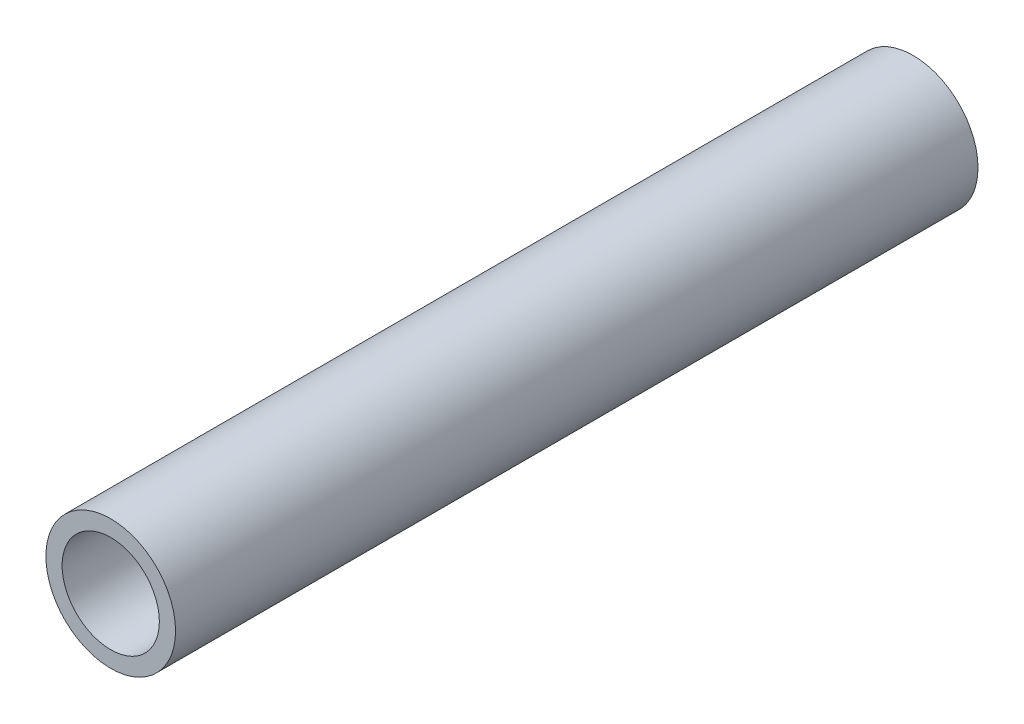
ISO-10303-21;
HEADER;
FILE_DESCRIPTION(('STEP AP214'),'2;1');
FILE_NAME('part.step','',(''),(''),'','','');
FILE_SCHEMA(('AUTOMOTIVE_DESIGN { 1 0 10303 214 1 1 1 1 }'));
ENDSEC;
DATA;
#1=APPLICATION_CONTEXT('core data for automotive mechanical design processes');
#2=APPLICATION_PROTOCOL_DEFINITION('international standard','automotive_design',2000,#1);
#3=PRODUCT_CONTEXT('',#1,'mechanical');
#4=PRODUCT('Part','Part','',(#3));
#5=PRODUCT_RELATED_PRODUCT_CATEGORY('part','',(#4));
#6=PRODUCT_DEFINITION_FORMATION('','',#4);
#7=PRODUCT_DEFINITION_CONTEXT('part definition',#1,'design');
#8=PRODUCT_DEFINITION('design','',#6,#7);
#9=PRODUCT_DEFINITION_SHAPE('','',#8);
#10=(LENGTH_UNIT() NAMED_UNIT(*) SI_UNIT(.MILLI.,.METRE.));
#11=(NAMED_UNIT(*) PLANE_ANGLE_UNIT() SI_UNIT($,.RADIAN.));
#12=(NAMED_UNIT(*) SI_UNIT($,.STERADIAN.) SOLID_ANGLE_UNIT());
#13=UNCERTAINTY_MEASURE_WITH_UNIT(LENGTH_MEASURE(1.E-05),#10,'distance_accuracy_value','');
#14=(GEOMETRIC_REPRESENTATION_CONTEXT(3) GLOBAL_UNCERTAINTY_ASSIGNED_CONTEXT((#13)) GLOBAL_UNIT_ASSIGNED_CONTEXT((#10,
#11,#12)) REPRESENTATION_CONTEXT('',''));
#15=CARTESIAN_POINT('',(0.,0.,0.));
#16=DIRECTION('',(0.,0.,1.));
#17=DIRECTION('',(1.,0.,0.));
#18=AXIS2_PLACEMENT_3D('',#15,#16,#17);
#19=CARTESIAN_POINT('',(0.,0.,49.5));
#20=DIRECTION('',(0.,0.,1.));
#21=DIRECTION('',(1.,0.,0.));
#22=AXIS2_PLACEMENT_3D('',#19,#20,#21);
#23=PLANE('',#22);
#24=CARTESIAN_POINT('',(0.,0.,49.5));
#25=DIRECTION('',(0.,0.,1.));
#26=DIRECTION('',(1.,0.,0.));
#27=AXIS2_PLACEMENT_3D('',#24,#25,#26);
#28=CIRCLE('',#27,4.);
#29=CARTESIAN_POINT('',(4.,0.,49.5));
#30=VERTEX_POINT('',#29);
#31=EDGE_CURVE('E11',#30,#30,#28,.T.);
#32=ORIENTED_EDGE('',*,*,#31,.T.);
#33=EDGE_LOOP('',(#32));
#34=FACE_BOUND('',#33,.T.);
#35=CARTESIAN_POINT('',(0.,0.,49.5));
#36=DIRECTION('',(0.,0.,1.));
#37=DIRECTION('',(1.,0.,0.));
#38=AXIS2_PLACEMENT_3D('',#35,#36,#37);
#39=CIRCLE('',#38,3.);
#40=CARTESIAN_POINT('',(3.,0.,49.5));
#41=VERTEX_POINT('',#40);
#42=EDGE_CURVE('E62',#41,#41,#39,.T.);
#43=ORIENTED_EDGE('',*,*,#42,.F.);
#44=EDGE_LOOP('',(#43));
#45=FACE_BOUND('',#44,.T.);
#46=ADVANCED_FACE('F48',(#34,#45),#23,.T.);
#47=CARTESIAN_POINT('',(0.,0.,0.));
#48=DIRECTION('',(0.,0.,1.));
#49=DIRECTION('',(1.,0.,0.));
#50=AXIS2_PLACEMENT_3D('',#47,#48,#49);
#51=PLANE('',#50);
#52=CARTESIAN_POINT('',(0.,0.,0.));
#53=DIRECTION('',(0.,0.,1.));
#54=DIRECTION('',(1.,0.,0.));
#55=AXIS2_PLACEMENT_3D('',#52,#53,#54);
#56=CIRCLE('',#55,4.);
#57=CARTESIAN_POINT('',(4.,0.,0.));
#58=VERTEX_POINT('',#57);
#59=EDGE_CURVE('E55',#58,#58,#56,.T.);
#60=ORIENTED_EDGE('',*,*,#59,.F.);
#61=EDGE_LOOP('',(#60));
#62=FACE_BOUND('',#61,.T.);
#63=CARTESIAN_POINT('',(0.,0.,0.));
#64=DIRECTION('',(0.,0.,1.));
#65=DIRECTION('',(1.,0.,0.));
#66=AXIS2_PLACEMENT_3D('',#63,#64,#65);
#67=CIRCLE('',#66,3.);
#68=CARTESIAN_POINT('',(3.,0.,0.));
#69=VERTEX_POINT('',#68);
#70=EDGE_CURVE('E63',#69,#69,#67,.T.);
#71=ORIENTED_EDGE('',*,*,#70,.T.);
#72=EDGE_LOOP('',(#71));
#73=FACE_BOUND('',#72,.T.);
#74=ADVANCED_FACE('F74',(#62,#73),#51,.F.);
#75=CARTESIAN_POINT('',(0.,0.,49.5));
#76=DIRECTION('',(0.,0.,-1.));
#77=DIRECTION('',(-1.,0.,0.));
#78=AXIS2_PLACEMENT_3D('',#75,#76,#77);
#79=CYLINDRICAL_SURFACE('',#78,4.);
#80=ORIENTED_EDGE('',*,*,#31,.F.);
#81=EDGE_LOOP('',(#80));
#82=FACE_BOUND('',#81,.T.);
#83=ORIENTED_EDGE('',*,*,#59,.T.);
#84=EDGE_LOOP('',(#83));
#85=FACE_BOUND('',#84,.T.);
#86=ADVANCED_FACE('F49',(#82,#85),#79,.T.);
#87=CARTESIAN_POINT('',(0.,0.,49.5));
#88=DIRECTION('',(0.,0.,-1.));
#89=DIRECTION('',(-1.,0.,0.));
#90=AXIS2_PLACEMENT_3D('',#87,#88,#89);
#91=CYLINDRICAL_SURFACE('',#90,3.);
#92=ORIENTED_EDGE('',*,*,#42,.T.);
#93=EDGE_LOOP('',(#92));
#94=FACE_BOUND('',#93,.T.);
#95=ORIENTED_EDGE('',*,*,#70,.F.);
#96=EDGE_LOOP('',(#95));
#97=FACE_BOUND('',#96,.T.);
#98=ADVANCED_FACE('F73',(#94,#97),#91,.F.);
#99=CLOSED_SHELL('',(#46,#74,#86,#98));
#100=MANIFOLD_SOLID_BREP('B2',#99);
#101=ADVANCED_BREP_SHAPE_REPRESENTATION('',(#18,#100),#14);
#102=SHAPE_DEFINITION_REPRESENTATION(#9,#101);
ENDSEC;
END-ISO-10303-21;
